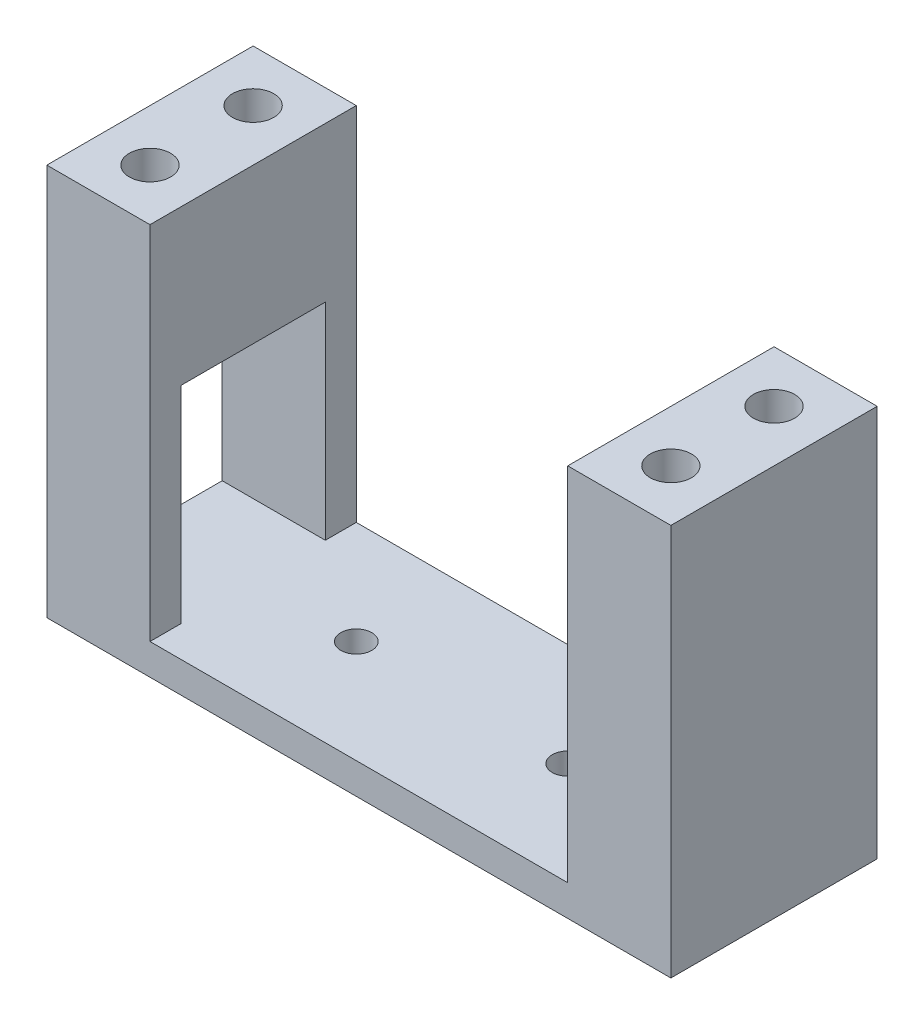
ISO-10303-21;
HEADER;
FILE_DESCRIPTION(('STEP AP214'),'2;1');
FILE_NAME('part.step','',(''),(''),'','','');
FILE_SCHEMA(('AUTOMOTIVE_DESIGN { 1 0 10303 214 1 1 1 1 }'));
ENDSEC;
DATA;
#1=APPLICATION_CONTEXT('core data for automotive mechanical design processes');
#2=APPLICATION_PROTOCOL_DEFINITION('international standard','automotive_design',2000,#1);
#3=PRODUCT_CONTEXT('',#1,'mechanical');
#4=PRODUCT('Part','Part','',(#3));
#5=PRODUCT_RELATED_PRODUCT_CATEGORY('part','',(#4));
#6=PRODUCT_DEFINITION_FORMATION('','',#4);
#7=PRODUCT_DEFINITION_CONTEXT('part definition',#1,'design');
#8=PRODUCT_DEFINITION('design','',#6,#7);
#9=PRODUCT_DEFINITION_SHAPE('','',#8);
#10=(LENGTH_UNIT() NAMED_UNIT(*) SI_UNIT(.MILLI.,.METRE.));
#11=(NAMED_UNIT(*) PLANE_ANGLE_UNIT() SI_UNIT($,.RADIAN.));
#12=(NAMED_UNIT(*) SI_UNIT($,.STERADIAN.) SOLID_ANGLE_UNIT());
#13=UNCERTAINTY_MEASURE_WITH_UNIT(LENGTH_MEASURE(1.E-05),#10,'distance_accuracy_value','');
#14=(GEOMETRIC_REPRESENTATION_CONTEXT(3) GLOBAL_UNCERTAINTY_ASSIGNED_CONTEXT((#13)) GLOBAL_UNIT_ASSIGNED_CONTEXT((#10,
#11,#12)) REPRESENTATION_CONTEXT('',''));
#15=CARTESIAN_POINT('',(0.,0.,0.));
#16=DIRECTION('',(0.,0.,1.));
#17=DIRECTION('',(1.,0.,0.));
#18=AXIS2_PLACEMENT_3D('',#15,#16,#17);
#19=CARTESIAN_POINT('',(0.,38.,20.));
#20=DIRECTION('',(1.,0.,0.));
#21=DIRECTION('',(0.,1.,0.));
#22=AXIS2_PLACEMENT_3D('',#19,#20,#21);
#23=PLANE('',#22);
#24=DIRECTION('',(0.,1.,0.));
#25=VECTOR('',#24,1.);
#26=CARTESIAN_POINT('',(0.,3.,17.));
#27=LINE('',#26,#25);
#28=CARTESIAN_POINT('',(0.,3.,17.));
#29=VERTEX_POINT('',#28);
#30=CARTESIAN_POINT('',(0.,23.,17.));
#31=VERTEX_POINT('',#30);
#32=EDGE_CURVE('E290',#29,#31,#27,.T.);
#33=ORIENTED_EDGE('',*,*,#32,.F.);
#34=DIRECTION('',(0.,0.,1.));
#35=VECTOR('',#34,1.);
#36=CARTESIAN_POINT('',(0.,3.,3.));
#37=LINE('',#36,#35);
#38=CARTESIAN_POINT('',(0.,3.,3.));
#39=VERTEX_POINT('',#38);
#40=EDGE_CURVE('E294',#39,#29,#37,.T.);
#41=ORIENTED_EDGE('',*,*,#40,.F.);
#42=DIRECTION('',(0.,-1.,0.));
#43=VECTOR('',#42,1.);
#44=CARTESIAN_POINT('',(0.,23.,3.));
#45=LINE('',#44,#43);
#46=CARTESIAN_POINT('',(0.,23.,3.));
#47=VERTEX_POINT('',#46);
#48=EDGE_CURVE('E151',#47,#39,#45,.T.);
#49=ORIENTED_EDGE('',*,*,#48,.F.);
#50=DIRECTION('',(0.,0.,-1.));
#51=VECTOR('',#50,1.);
#52=CARTESIAN_POINT('',(0.,23.,17.));
#53=LINE('',#52,#51);
#54=EDGE_CURVE('E55',#31,#47,#53,.T.);
#55=ORIENTED_EDGE('',*,*,#54,.F.);
#56=EDGE_LOOP('',(#33,#41,#49,#55));
#57=FACE_BOUND('',#56,.T.);
#58=DIRECTION('',(0.,-1.,0.));
#59=VECTOR('',#58,1.);
#60=CARTESIAN_POINT('',(0.,38.,0.));
#61=LINE('',#60,#59);
#62=CARTESIAN_POINT('',(0.,38.,0.));
#63=VERTEX_POINT('',#62);
#64=CARTESIAN_POINT('',(0.,0.,0.));
#65=VERTEX_POINT('',#64);
#66=EDGE_CURVE('E162',#63,#65,#61,.T.);
#67=ORIENTED_EDGE('',*,*,#66,.T.);
#68=DIRECTION('',(0.,0.,-1.));
#69=VECTOR('',#68,1.);
#70=CARTESIAN_POINT('',(0.,0.,20.));
#71=LINE('',#70,#69);
#72=CARTESIAN_POINT('',(0.,0.,20.));
#73=VERTEX_POINT('',#72);
#74=EDGE_CURVE('E11',#73,#65,#71,.T.);
#75=ORIENTED_EDGE('',*,*,#74,.F.);
#76=DIRECTION('',(0.,-1.,0.));
#77=VECTOR('',#76,1.);
#78=CARTESIAN_POINT('',(0.,38.,20.));
#79=LINE('',#78,#77);
#80=CARTESIAN_POINT('',(0.,38.,20.));
#81=VERTEX_POINT('',#80);
#82=EDGE_CURVE('E163',#81,#73,#79,.T.);
#83=ORIENTED_EDGE('',*,*,#82,.F.);
#84=DIRECTION('',(0.,0.,-1.));
#85=VECTOR('',#84,1.);
#86=CARTESIAN_POINT('',(0.,38.,20.));
#87=LINE('',#86,#85);
#88=EDGE_CURVE('E189',#81,#63,#87,.T.);
#89=ORIENTED_EDGE('',*,*,#88,.T.);
#90=EDGE_LOOP('',(#67,#75,#83,#89));
#91=FACE_BOUND('',#90,.T.);
#92=ADVANCED_FACE('F38',(#57,#91),#23,.F.);
#93=CARTESIAN_POINT('',(0.,0.,20.));
#94=DIRECTION('',(0.,1.,0.));
#95=DIRECTION('',(0.,0.,1.));
#96=AXIS2_PLACEMENT_3D('',#93,#94,#95);
#97=PLANE('',#96);
#98=CARTESIAN_POINT('',(20.,0.,10.));
#99=DIRECTION('',(0.,-1.,0.));
#100=DIRECTION('',(0.,0.,-1.));
#101=AXIS2_PLACEMENT_3D('',#98,#99,#100);
#102=CIRCLE('',#101,1.5);
#103=CARTESIAN_POINT('',(20.,0.,8.5));
#104=VERTEX_POINT('',#103);
#105=EDGE_CURVE('E242',#104,#104,#102,.T.);
#106=ORIENTED_EDGE('',*,*,#105,.F.);
#107=EDGE_LOOP('',(#106));
#108=FACE_BOUND('',#107,.T.);
#109=CARTESIAN_POINT('',(40.5,0.,10.));
#110=DIRECTION('',(0.,-1.,0.));
#111=DIRECTION('',(0.,0.,-1.));
#112=AXIS2_PLACEMENT_3D('',#109,#110,#111);
#113=CIRCLE('',#112,1.5);
#114=CARTESIAN_POINT('',(40.5,0.,8.49999999999999));
#115=VERTEX_POINT('',#114);
#116=EDGE_CURVE('E250',#115,#115,#113,.T.);
#117=ORIENTED_EDGE('',*,*,#116,.F.);
#118=EDGE_LOOP('',(#117));
#119=FACE_BOUND('',#118,.T.);
#120=DIRECTION('',(1.,0.,0.));
#121=VECTOR('',#120,1.);
#122=CARTESIAN_POINT('',(0.,0.,0.));
#123=LINE('',#122,#121);
#124=CARTESIAN_POINT('',(60.5,0.,0.));
#125=VERTEX_POINT('',#124);
#126=EDGE_CURVE('E193',#65,#125,#123,.T.);
#127=ORIENTED_EDGE('',*,*,#126,.T.);
#128=DIRECTION('',(0.,0.,-1.));
#129=VECTOR('',#128,1.);
#130=CARTESIAN_POINT('',(60.5,0.,20.));
#131=LINE('',#130,#129);
#132=CARTESIAN_POINT('',(60.5,0.,20.));
#133=VERTEX_POINT('',#132);
#134=EDGE_CURVE('E47',#133,#125,#131,.T.);
#135=ORIENTED_EDGE('',*,*,#134,.F.);
#136=DIRECTION('',(1.,0.,0.));
#137=VECTOR('',#136,1.);
#138=CARTESIAN_POINT('',(0.,0.,20.));
#139=LINE('',#138,#137);
#140=EDGE_CURVE('E167',#73,#133,#139,.T.);
#141=ORIENTED_EDGE('',*,*,#140,.F.);
#142=ORIENTED_EDGE('',*,*,#74,.T.);
#143=EDGE_LOOP('',(#127,#135,#141,#142));
#144=FACE_BOUND('',#143,.T.);
#145=ADVANCED_FACE('F340',(#108,#119,#144),#97,.F.);
#146=CARTESIAN_POINT('',(60.5,0.,20.));
#147=DIRECTION('',(-1.,0.,0.));
#148=DIRECTION('',(0.,0.,1.));
#149=AXIS2_PLACEMENT_3D('',#146,#147,#148);
#150=PLANE('',#149);
#151=DIRECTION('',(0.,1.,0.));
#152=VECTOR('',#151,1.);
#153=CARTESIAN_POINT('',(60.5,0.,0.));
#154=LINE('',#153,#152);
#155=CARTESIAN_POINT('',(60.5,38.,0.));
#156=VERTEX_POINT('',#155);
#157=EDGE_CURVE('E196',#125,#156,#154,.T.);
#158=ORIENTED_EDGE('',*,*,#157,.T.);
#159=DIRECTION('',(0.,0.,-1.));
#160=VECTOR('',#159,1.);
#161=CARTESIAN_POINT('',(60.5,38.,20.));
#162=LINE('',#161,#160);
#163=CARTESIAN_POINT('',(60.5,38.,20.));
#164=VERTEX_POINT('',#163);
#165=EDGE_CURVE('E233',#164,#156,#162,.T.);
#166=ORIENTED_EDGE('',*,*,#165,.F.);
#167=DIRECTION('',(0.,1.,0.));
#168=VECTOR('',#167,1.);
#169=CARTESIAN_POINT('',(60.5,0.,20.));
#170=LINE('',#169,#168);
#171=EDGE_CURVE('E171',#133,#164,#170,.T.);
#172=ORIENTED_EDGE('',*,*,#171,.F.);
#173=ORIENTED_EDGE('',*,*,#134,.T.);
#174=EDGE_LOOP('',(#158,#166,#172,#173));
#175=FACE_BOUND('',#174,.T.);
#176=ADVANCED_FACE('F338',(#175),#150,.F.);
#177=CARTESIAN_POINT('',(60.5,38.,20.));
#178=DIRECTION('',(0.,-1.,0.));
#179=DIRECTION('',(0.,0.,-1.));
#180=AXIS2_PLACEMENT_3D('',#177,#178,#179);
#181=PLANE('',#180);
#182=CARTESIAN_POINT('',(55.5,38.,5.));
#183=DIRECTION('',(0.,1.,0.));
#184=DIRECTION('',(0.,0.,1.));
#185=AXIS2_PLACEMENT_3D('',#182,#183,#184);
#186=CIRCLE('',#185,2.);
#187=CARTESIAN_POINT('',(55.5,38.,7.));
#188=VERTEX_POINT('',#187);
#189=EDGE_CURVE('E262',#188,#188,#186,.T.);
#190=ORIENTED_EDGE('',*,*,#189,.F.);
#191=EDGE_LOOP('',(#190));
#192=FACE_BOUND('',#191,.T.);
#193=CARTESIAN_POINT('',(55.5,38.,15.));
#194=DIRECTION('',(0.,1.,0.));
#195=DIRECTION('',(0.,0.,1.));
#196=AXIS2_PLACEMENT_3D('',#193,#194,#195);
#197=CIRCLE('',#196,2.);
#198=CARTESIAN_POINT('',(55.5,38.,17.));
#199=VERTEX_POINT('',#198);
#200=EDGE_CURVE('E248',#199,#199,#197,.T.);
#201=ORIENTED_EDGE('',*,*,#200,.F.);
#202=EDGE_LOOP('',(#201));
#203=FACE_BOUND('',#202,.T.);
#204=DIRECTION('',(-1.,0.,0.));
#205=VECTOR('',#204,1.);
#206=CARTESIAN_POINT('',(60.5,38.,0.));
#207=LINE('',#206,#205);
#208=CARTESIAN_POINT('',(50.5,38.,0.));
#209=VERTEX_POINT('',#208);
#210=EDGE_CURVE('E199',#156,#209,#207,.T.);
#211=ORIENTED_EDGE('',*,*,#210,.T.);
#212=DIRECTION('',(0.,0.,-1.));
#213=VECTOR('',#212,1.);
#214=CARTESIAN_POINT('',(50.5,38.,20.));
#215=LINE('',#214,#213);
#216=CARTESIAN_POINT('',(50.5,38.,20.));
#217=VERTEX_POINT('',#216);
#218=EDGE_CURVE('E229',#217,#209,#215,.T.);
#219=ORIENTED_EDGE('',*,*,#218,.F.);
#220=DIRECTION('',(-1.,0.,0.));
#221=VECTOR('',#220,1.);
#222=CARTESIAN_POINT('',(60.5,38.,20.));
#223=LINE('',#222,#221);
#224=EDGE_CURVE('E174',#164,#217,#223,.T.);
#225=ORIENTED_EDGE('',*,*,#224,.F.);
#226=ORIENTED_EDGE('',*,*,#165,.T.);
#227=EDGE_LOOP('',(#211,#219,#225,#226));
#228=FACE_BOUND('',#227,.T.);
#229=ADVANCED_FACE('F334',(#192,#203,#228),#181,.F.);
#230=CARTESIAN_POINT('',(50.5,38.,20.));
#231=DIRECTION('',(1.,0.,0.));
#232=DIRECTION('',(0.,1.,0.));
#233=AXIS2_PLACEMENT_3D('',#230,#231,#232);
#234=PLANE('',#233);
#235=DIRECTION('',(0.,-1.,0.));
#236=VECTOR('',#235,1.);
#237=CARTESIAN_POINT('',(50.5,38.,0.));
#238=LINE('',#237,#236);
#239=CARTESIAN_POINT('',(50.5,3.,0.));
#240=VERTEX_POINT('',#239);
#241=EDGE_CURVE('E202',#209,#240,#238,.T.);
#242=ORIENTED_EDGE('',*,*,#241,.T.);
#243=DIRECTION('',(0.,0.,-1.));
#244=VECTOR('',#243,1.);
#245=CARTESIAN_POINT('',(50.5,3.,20.));
#246=LINE('',#245,#244);
#247=CARTESIAN_POINT('',(50.5,3.,20.));
#248=VERTEX_POINT('',#247);
#249=EDGE_CURVE('E225',#248,#240,#246,.T.);
#250=ORIENTED_EDGE('',*,*,#249,.F.);
#251=DIRECTION('',(0.,-1.,0.));
#252=VECTOR('',#251,1.);
#253=CARTESIAN_POINT('',(50.5,38.,20.));
#254=LINE('',#253,#252);
#255=EDGE_CURVE('E177',#217,#248,#254,.T.);
#256=ORIENTED_EDGE('',*,*,#255,.F.);
#257=ORIENTED_EDGE('',*,*,#218,.T.);
#258=EDGE_LOOP('',(#242,#250,#256,#257));
#259=FACE_BOUND('',#258,.T.);
#260=ADVANCED_FACE('F330',(#259),#234,.F.);
#261=CARTESIAN_POINT('',(50.5,3.,20.));
#262=DIRECTION('',(0.,-1.,0.));
#263=DIRECTION('',(1.,0.,0.));
#264=AXIS2_PLACEMENT_3D('',#261,#262,#263);
#265=PLANE('',#264);
#266=CARTESIAN_POINT('',(20.,3.,10.));
#267=DIRECTION('',(0.,-1.,0.));
#268=DIRECTION('',(1.,0.,0.));
#269=AXIS2_PLACEMENT_3D('',#266,#267,#268);
#270=CIRCLE('',#269,1.5);
#271=CARTESIAN_POINT('',(21.5,3.,10.));
#272=VERTEX_POINT('',#271);
#273=EDGE_CURVE('E41',#272,#272,#270,.T.);
#274=ORIENTED_EDGE('',*,*,#273,.T.);
#275=EDGE_LOOP('',(#274));
#276=FACE_BOUND('',#275,.T.);
#277=CARTESIAN_POINT('',(40.5,3.,10.));
#278=DIRECTION('',(0.,-1.,0.));
#279=DIRECTION('',(1.,0.,0.));
#280=AXIS2_PLACEMENT_3D('',#277,#278,#279);
#281=CIRCLE('',#280,1.5);
#282=CARTESIAN_POINT('',(42.,3.,10.));
#283=VERTEX_POINT('',#282);
#284=EDGE_CURVE('E239',#283,#283,#281,.T.);
#285=ORIENTED_EDGE('',*,*,#284,.T.);
#286=EDGE_LOOP('',(#285));
#287=FACE_BOUND('',#286,.T.);
#288=DIRECTION('',(-1.,0.,0.));
#289=VECTOR('',#288,1.);
#290=CARTESIAN_POINT('',(50.5,3.,0.));
#291=LINE('',#290,#289);
#292=CARTESIAN_POINT('',(10.,3.,0.));
#293=VERTEX_POINT('',#292);
#294=EDGE_CURVE('E205',#240,#293,#291,.T.);
#295=ORIENTED_EDGE('',*,*,#294,.T.);
#296=DIRECTION('',(0.,0.,-1.));
#297=VECTOR('',#296,1.);
#298=CARTESIAN_POINT('',(10.,3.,20.));
#299=LINE('',#298,#297);
#300=CARTESIAN_POINT('',(10.,3.,3.));
#301=VERTEX_POINT('',#300);
#302=EDGE_CURVE('E221',#301,#293,#299,.T.);
#303=ORIENTED_EDGE('',*,*,#302,.F.);
#304=DIRECTION('',(-1.,0.,0.));
#305=VECTOR('',#304,1.);
#306=CARTESIAN_POINT('',(60.501,3.00000000000002,3.));
#307=LINE('',#306,#305);
#308=EDGE_CURVE('E63',#301,#39,#307,.T.);
#309=ORIENTED_EDGE('',*,*,#308,.T.);
#310=ORIENTED_EDGE('',*,*,#40,.T.);
#311=DIRECTION('',(-1.,0.,0.));
#312=VECTOR('',#311,1.);
#313=CARTESIAN_POINT('',(60.501,3.00000000000002,17.));
#314=LINE('',#313,#312);
#315=CARTESIAN_POINT('',(10.,3.,17.));
#316=VERTEX_POINT('',#315);
#317=EDGE_CURVE('E157',#316,#29,#314,.T.);
#318=ORIENTED_EDGE('',*,*,#317,.F.);
#319=CARTESIAN_POINT('',(10.,3.,20.));
#320=VERTEX_POINT('',#319);
#321=EDGE_CURVE('E222',#320,#316,#299,.T.);
#322=ORIENTED_EDGE('',*,*,#321,.F.);
#323=DIRECTION('',(-1.,0.,0.));
#324=VECTOR('',#323,1.);
#325=CARTESIAN_POINT('',(50.5,3.,20.));
#326=LINE('',#325,#324);
#327=EDGE_CURVE('E180',#248,#320,#326,.T.);
#328=ORIENTED_EDGE('',*,*,#327,.F.);
#329=ORIENTED_EDGE('',*,*,#249,.T.);
#330=EDGE_LOOP('',(#295,#303,#309,#310,#318,#322,#328,#329));
#331=FACE_BOUND('',#330,.T.);
#332=ADVANCED_FACE('F303',(#276,#287,#331),#265,.F.);
#333=CARTESIAN_POINT('',(10.,3.,20.));
#334=DIRECTION('',(-1.,0.,0.));
#335=DIRECTION('',(0.,-1.,0.));
#336=AXIS2_PLACEMENT_3D('',#333,#334,#335);
#337=PLANE('',#336);
#338=ORIENTED_EDGE('',*,*,#321,.T.);
#339=DIRECTION('',(0.,-1.,0.));
#340=VECTOR('',#339,1.);
#341=CARTESIAN_POINT('',(10.,3.,17.));
#342=LINE('',#341,#340);
#343=CARTESIAN_POINT('',(9.99999999999999,23.,17.));
#344=VERTEX_POINT('',#343);
#345=EDGE_CURVE('E147',#344,#316,#342,.T.);
#346=ORIENTED_EDGE('',*,*,#345,.F.);
#347=DIRECTION('',(0.,0.,1.));
#348=VECTOR('',#347,1.);
#349=CARTESIAN_POINT('',(9.99999999999999,23.,17.));
#350=LINE('',#349,#348);
#351=CARTESIAN_POINT('',(9.99999999999999,23.,3.));
#352=VERTEX_POINT('',#351);
#353=EDGE_CURVE('E131',#352,#344,#350,.T.);
#354=ORIENTED_EDGE('',*,*,#353,.F.);
#355=DIRECTION('',(0.,1.,0.));
#356=VECTOR('',#355,1.);
#357=CARTESIAN_POINT('',(9.99999999999999,23.,3.));
#358=LINE('',#357,#356);
#359=EDGE_CURVE('E137',#301,#352,#358,.T.);
#360=ORIENTED_EDGE('',*,*,#359,.F.);
#361=ORIENTED_EDGE('',*,*,#302,.T.);
#362=DIRECTION('',(0.,1.,0.));
#363=VECTOR('',#362,1.);
#364=CARTESIAN_POINT('',(10.,3.,0.));
#365=LINE('',#364,#363);
#366=CARTESIAN_POINT('',(9.99999999999999,38.,0.));
#367=VERTEX_POINT('',#366);
#368=EDGE_CURVE('E209',#293,#367,#365,.T.);
#369=ORIENTED_EDGE('',*,*,#368,.T.);
#370=DIRECTION('',(0.,0.,-1.));
#371=VECTOR('',#370,1.);
#372=CARTESIAN_POINT('',(9.99999999999999,38.,20.));
#373=LINE('',#372,#371);
#374=CARTESIAN_POINT('',(9.99999999999999,38.,20.));
#375=VERTEX_POINT('',#374);
#376=EDGE_CURVE('E217',#375,#367,#373,.T.);
#377=ORIENTED_EDGE('',*,*,#376,.F.);
#378=DIRECTION('',(0.,1.,0.));
#379=VECTOR('',#378,1.);
#380=CARTESIAN_POINT('',(10.,3.,20.));
#381=LINE('',#380,#379);
#382=EDGE_CURVE('E183',#320,#375,#381,.T.);
#383=ORIENTED_EDGE('',*,*,#382,.F.);
#384=EDGE_LOOP('',(#338,#346,#354,#360,#361,#369,#377,#383));
#385=FACE_BOUND('',#384,.T.);
#386=ADVANCED_FACE('F145',(#385),#337,.F.);
#387=CARTESIAN_POINT('',(9.99999999999999,38.,20.));
#388=DIRECTION('',(0.,-1.,0.));
#389=DIRECTION('',(0.,0.,-1.));
#390=AXIS2_PLACEMENT_3D('',#387,#388,#389);
#391=PLANE('',#390);
#392=CARTESIAN_POINT('',(4.99999999999999,38.,15.));
#393=DIRECTION('',(0.,1.,0.));
#394=DIRECTION('',(0.,0.,1.));
#395=AXIS2_PLACEMENT_3D('',#392,#393,#394);
#396=CIRCLE('',#395,2.);
#397=CARTESIAN_POINT('',(4.99999999999999,38.,17.));
#398=VERTEX_POINT('',#397);
#399=EDGE_CURVE('E271',#398,#398,#396,.T.);
#400=ORIENTED_EDGE('',*,*,#399,.F.);
#401=EDGE_LOOP('',(#400));
#402=FACE_BOUND('',#401,.T.);
#403=CARTESIAN_POINT('',(4.99999999999999,38.,5.));
#404=DIRECTION('',(0.,1.,0.));
#405=DIRECTION('',(0.,0.,1.));
#406=AXIS2_PLACEMENT_3D('',#403,#404,#405);
#407=CIRCLE('',#406,2.);
#408=CARTESIAN_POINT('',(4.99999999999999,38.,7.));
#409=VERTEX_POINT('',#408);
#410=EDGE_CURVE('E270',#409,#409,#407,.T.);
#411=ORIENTED_EDGE('',*,*,#410,.F.);
#412=EDGE_LOOP('',(#411));
#413=FACE_BOUND('',#412,.T.);
#414=DIRECTION('',(-1.,0.,0.));
#415=VECTOR('',#414,1.);
#416=CARTESIAN_POINT('',(9.99999999999999,38.,0.));
#417=LINE('',#416,#415);
#418=EDGE_CURVE('E168',#367,#63,#417,.T.);
#419=ORIENTED_EDGE('',*,*,#418,.T.);
#420=ORIENTED_EDGE('',*,*,#88,.F.);
#421=DIRECTION('',(-1.,0.,0.));
#422=VECTOR('',#421,1.);
#423=CARTESIAN_POINT('',(9.99999999999999,38.,20.));
#424=LINE('',#423,#422);
#425=EDGE_CURVE('E186',#375,#81,#424,.T.);
#426=ORIENTED_EDGE('',*,*,#425,.F.);
#427=ORIENTED_EDGE('',*,*,#376,.T.);
#428=EDGE_LOOP('',(#419,#420,#426,#427));
#429=FACE_BOUND('',#428,.T.);
#430=ADVANCED_FACE('F314',(#402,#413,#429),#391,.F.);
#431=CARTESIAN_POINT('',(0.,0.,20.));
#432=DIRECTION('',(0.,0.,1.));
#433=DIRECTION('',(1.,0.,0.));
#434=AXIS2_PLACEMENT_3D('',#431,#432,#433);
#435=PLANE('',#434);
#436=ORIENTED_EDGE('',*,*,#82,.T.);
#437=ORIENTED_EDGE('',*,*,#140,.T.);
#438=ORIENTED_EDGE('',*,*,#171,.T.);
#439=ORIENTED_EDGE('',*,*,#224,.T.);
#440=ORIENTED_EDGE('',*,*,#255,.T.);
#441=ORIENTED_EDGE('',*,*,#327,.T.);
#442=ORIENTED_EDGE('',*,*,#382,.T.);
#443=ORIENTED_EDGE('',*,*,#425,.T.);
#444=EDGE_LOOP('',(#436,#437,#438,#439,#440,#441,#442,#443));
#445=FACE_BOUND('',#444,.T.);
#446=ADVANCED_FACE('F322',(#445),#435,.T.);
#447=CARTESIAN_POINT('',(0.,0.,0.));
#448=DIRECTION('',(0.,0.,1.));
#449=DIRECTION('',(1.,0.,0.));
#450=AXIS2_PLACEMENT_3D('',#447,#448,#449);
#451=PLANE('',#450);
#452=ORIENTED_EDGE('',*,*,#66,.F.);
#453=ORIENTED_EDGE('',*,*,#418,.F.);
#454=ORIENTED_EDGE('',*,*,#368,.F.);
#455=ORIENTED_EDGE('',*,*,#294,.F.);
#456=ORIENTED_EDGE('',*,*,#241,.F.);
#457=ORIENTED_EDGE('',*,*,#210,.F.);
#458=ORIENTED_EDGE('',*,*,#157,.F.);
#459=ORIENTED_EDGE('',*,*,#126,.F.);
#460=EDGE_LOOP('',(#452,#453,#454,#455,#456,#457,#458,#459));
#461=FACE_BOUND('',#460,.T.);
#462=ADVANCED_FACE('F317',(#461),#451,.F.);
#463=CARTESIAN_POINT('',(60.501,3.00000000000002,17.));
#464=DIRECTION('',(0.,0.,1.));
#465=DIRECTION('',(1.,0.,0.));
#466=AXIS2_PLACEMENT_3D('',#463,#464,#465);
#467=PLANE('',#466);
#468=ORIENTED_EDGE('',*,*,#345,.T.);
#469=ORIENTED_EDGE('',*,*,#317,.T.);
#470=ORIENTED_EDGE('',*,*,#32,.T.);
#471=DIRECTION('',(-1.,0.,0.));
#472=VECTOR('',#471,1.);
#473=CARTESIAN_POINT('',(60.501,23.,17.));
#474=LINE('',#473,#472);
#475=EDGE_CURVE('E135',#344,#31,#474,.T.);
#476=ORIENTED_EDGE('',*,*,#475,.F.);
#477=EDGE_LOOP('',(#468,#469,#470,#476));
#478=FACE_BOUND('',#477,.T.);
#479=ADVANCED_FACE('F366',(#478),#467,.F.);
#480=CARTESIAN_POINT('',(60.501,23.,17.));
#481=DIRECTION('',(0.,1.,0.));
#482=DIRECTION('',(-1.,0.,0.));
#483=AXIS2_PLACEMENT_3D('',#480,#481,#482);
#484=PLANE('',#483);
#485=ORIENTED_EDGE('',*,*,#353,.T.);
#486=ORIENTED_EDGE('',*,*,#475,.T.);
#487=ORIENTED_EDGE('',*,*,#54,.T.);
#488=DIRECTION('',(-1.,0.,0.));
#489=VECTOR('',#488,1.);
#490=CARTESIAN_POINT('',(60.501,23.,3.));
#491=LINE('',#490,#489);
#492=EDGE_CURVE('E128',#352,#47,#491,.T.);
#493=ORIENTED_EDGE('',*,*,#492,.F.);
#494=EDGE_LOOP('',(#485,#486,#487,#493));
#495=FACE_BOUND('',#494,.T.);
#496=ADVANCED_FACE('F129',(#495),#484,.F.);
#497=CARTESIAN_POINT('',(60.501,23.,3.));
#498=DIRECTION('',(0.,0.,-1.));
#499=DIRECTION('',(0.,1.,0.));
#500=AXIS2_PLACEMENT_3D('',#497,#498,#499);
#501=PLANE('',#500);
#502=ORIENTED_EDGE('',*,*,#359,.T.);
#503=ORIENTED_EDGE('',*,*,#492,.T.);
#504=ORIENTED_EDGE('',*,*,#48,.T.);
#505=ORIENTED_EDGE('',*,*,#308,.F.);
#506=EDGE_LOOP('',(#502,#503,#504,#505));
#507=FACE_BOUND('',#506,.T.);
#508=ADVANCED_FACE('F138',(#507),#501,.F.);
#509=CARTESIAN_POINT('',(4.99999999999999,28.,5.));
#510=DIRECTION('',(0.,1.,0.));
#511=DIRECTION('',(0.,0.,1.));
#512=AXIS2_PLACEMENT_3D('',#509,#510,#511);
#513=CYLINDRICAL_SURFACE('',#512,2.);
#514=CARTESIAN_POINT('',(4.99999999999999,28.,5.));
#515=DIRECTION('',(0.,1.,0.));
#516=DIRECTION('',(0.,0.,1.));
#517=AXIS2_PLACEMENT_3D('',#514,#515,#516);
#518=CIRCLE('',#517,2.);
#519=CARTESIAN_POINT('',(4.99999999999999,28.,7.));
#520=VERTEX_POINT('',#519);
#521=EDGE_CURVE('E142',#520,#520,#518,.T.);
#522=ORIENTED_EDGE('',*,*,#521,.F.);
#523=EDGE_LOOP('',(#522));
#524=FACE_BOUND('',#523,.T.);
#525=ORIENTED_EDGE('',*,*,#410,.T.);
#526=EDGE_LOOP('',(#525));
#527=FACE_BOUND('',#526,.T.);
#528=ADVANCED_FACE('F376',(#524,#527),#513,.F.);
#529=CARTESIAN_POINT('',(4.99999999999999,28.,5.));
#530=DIRECTION('',(0.,1.,0.));
#531=DIRECTION('',(0.,0.,1.));
#532=AXIS2_PLACEMENT_3D('',#529,#530,#531);
#533=PLANE('',#532);
#534=ORIENTED_EDGE('',*,*,#521,.T.);
#535=EDGE_LOOP('',(#534));
#536=FACE_BOUND('',#535,.T.);
#537=ADVANCED_FACE('F379',(#536),#533,.T.);
#538=CARTESIAN_POINT('',(4.99999999999999,28.,15.));
#539=DIRECTION('',(0.,1.,0.));
#540=DIRECTION('',(0.,0.,1.));
#541=AXIS2_PLACEMENT_3D('',#538,#539,#540);
#542=CYLINDRICAL_SURFACE('',#541,2.);
#543=CARTESIAN_POINT('',(4.99999999999999,28.,15.));
#544=DIRECTION('',(0.,1.,0.));
#545=DIRECTION('',(0.,0.,1.));
#546=AXIS2_PLACEMENT_3D('',#543,#544,#545);
#547=CIRCLE('',#546,2.);
#548=CARTESIAN_POINT('',(4.99999999999999,28.,17.));
#549=VERTEX_POINT('',#548);
#550=EDGE_CURVE('E266',#549,#549,#547,.T.);
#551=ORIENTED_EDGE('',*,*,#550,.F.);
#552=EDGE_LOOP('',(#551));
#553=FACE_BOUND('',#552,.T.);
#554=ORIENTED_EDGE('',*,*,#399,.T.);
#555=EDGE_LOOP('',(#554));
#556=FACE_BOUND('',#555,.T.);
#557=ADVANCED_FACE('F383',(#553,#556),#542,.F.);
#558=CARTESIAN_POINT('',(4.99999999999999,28.,15.));
#559=DIRECTION('',(0.,1.,0.));
#560=DIRECTION('',(0.,0.,1.));
#561=AXIS2_PLACEMENT_3D('',#558,#559,#560);
#562=PLANE('',#561);
#563=ORIENTED_EDGE('',*,*,#550,.T.);
#564=EDGE_LOOP('',(#563));
#565=FACE_BOUND('',#564,.T.);
#566=ADVANCED_FACE('F397',(#565),#562,.T.);
#567=CARTESIAN_POINT('',(55.5,28.,15.));
#568=DIRECTION('',(0.,1.,0.));
#569=DIRECTION('',(0.,0.,1.));
#570=AXIS2_PLACEMENT_3D('',#567,#568,#569);
#571=CYLINDRICAL_SURFACE('',#570,2.);
#572=CARTESIAN_POINT('',(55.5,28.,15.));
#573=DIRECTION('',(0.,1.,0.));
#574=DIRECTION('',(0.,0.,1.));
#575=AXIS2_PLACEMENT_3D('',#572,#573,#574);
#576=CIRCLE('',#575,2.);
#577=CARTESIAN_POINT('',(55.5,28.,17.));
#578=VERTEX_POINT('',#577);
#579=EDGE_CURVE('E258',#578,#578,#576,.T.);
#580=ORIENTED_EDGE('',*,*,#579,.F.);
#581=EDGE_LOOP('',(#580));
#582=FACE_BOUND('',#581,.T.);
#583=ORIENTED_EDGE('',*,*,#200,.T.);
#584=EDGE_LOOP('',(#583));
#585=FACE_BOUND('',#584,.T.);
#586=ADVANCED_FACE('F401',(#582,#585),#571,.F.);
#587=CARTESIAN_POINT('',(55.5,28.,15.));
#588=DIRECTION('',(0.,1.,0.));
#589=DIRECTION('',(0.,0.,1.));
#590=AXIS2_PLACEMENT_3D('',#587,#588,#589);
#591=PLANE('',#590);
#592=ORIENTED_EDGE('',*,*,#579,.T.);
#593=EDGE_LOOP('',(#592));
#594=FACE_BOUND('',#593,.T.);
#595=ADVANCED_FACE('F389',(#594),#591,.T.);
#596=CARTESIAN_POINT('',(55.5,28.,5.));
#597=DIRECTION('',(0.,1.,0.));
#598=DIRECTION('',(0.,0.,1.));
#599=AXIS2_PLACEMENT_3D('',#596,#597,#598);
#600=CYLINDRICAL_SURFACE('',#599,2.);
#601=CARTESIAN_POINT('',(55.5,28.,5.));
#602=DIRECTION('',(0.,1.,0.));
#603=DIRECTION('',(0.,0.,1.));
#604=AXIS2_PLACEMENT_3D('',#601,#602,#603);
#605=CIRCLE('',#604,2.);
#606=CARTESIAN_POINT('',(55.5,28.,7.));
#607=VERTEX_POINT('',#606);
#608=EDGE_CURVE('E275',#607,#607,#605,.T.);
#609=ORIENTED_EDGE('',*,*,#608,.F.);
#610=EDGE_LOOP('',(#609));
#611=FACE_BOUND('',#610,.T.);
#612=ORIENTED_EDGE('',*,*,#189,.T.);
#613=EDGE_LOOP('',(#612));
#614=FACE_BOUND('',#613,.T.);
#615=ADVANCED_FACE('F385',(#611,#614),#600,.F.);
#616=CARTESIAN_POINT('',(55.5,28.,5.));
#617=DIRECTION('',(0.,1.,0.));
#618=DIRECTION('',(0.,0.,1.));
#619=AXIS2_PLACEMENT_3D('',#616,#617,#618);
#620=PLANE('',#619);
#621=ORIENTED_EDGE('',*,*,#608,.T.);
#622=EDGE_LOOP('',(#621));
#623=FACE_BOUND('',#622,.T.);
#624=ADVANCED_FACE('F388',(#623),#620,.T.);
#625=CARTESIAN_POINT('',(40.5,10.,10.));
#626=DIRECTION('',(0.,-1.,0.));
#627=DIRECTION('',(0.,0.,-1.));
#628=AXIS2_PLACEMENT_3D('',#625,#626,#627);
#629=CYLINDRICAL_SURFACE('',#628,1.5);
#630=ORIENTED_EDGE('',*,*,#116,.T.);
#631=EDGE_LOOP('',(#630));
#632=FACE_BOUND('',#631,.T.);
#633=ORIENTED_EDGE('',*,*,#284,.F.);
#634=EDGE_LOOP('',(#633));
#635=FACE_BOUND('',#634,.T.);
#636=ADVANCED_FACE('F393',(#632,#635),#629,.F.);
#637=CARTESIAN_POINT('',(20.,10.,10.));
#638=DIRECTION('',(0.,-1.,0.));
#639=DIRECTION('',(0.,0.,-1.));
#640=AXIS2_PLACEMENT_3D('',#637,#638,#639);
#641=CYLINDRICAL_SURFACE('',#640,1.5);
#642=ORIENTED_EDGE('',*,*,#105,.T.);
#643=EDGE_LOOP('',(#642));
#644=FACE_BOUND('',#643,.T.);
#645=ORIENTED_EDGE('',*,*,#273,.F.);
#646=EDGE_LOOP('',(#645));
#647=FACE_BOUND('',#646,.T.);
#648=ADVANCED_FACE('F411',(#644,#647),#641,.F.);
#649=CLOSED_SHELL('',(#92,#145,#176,#229,#260,#332,#386,#430,#446,#462,#479,#496,#508,#528,#537,
#557,#566,#586,#595,#615,#624,#636,#648));
#650=MANIFOLD_SOLID_BREP('B2',#649);
#651=ADVANCED_BREP_SHAPE_REPRESENTATION('',(#18,#650),#14);
#652=SHAPE_DEFINITION_REPRESENTATION(#9,#651);
ENDSEC;
END-ISO-10303-21;
